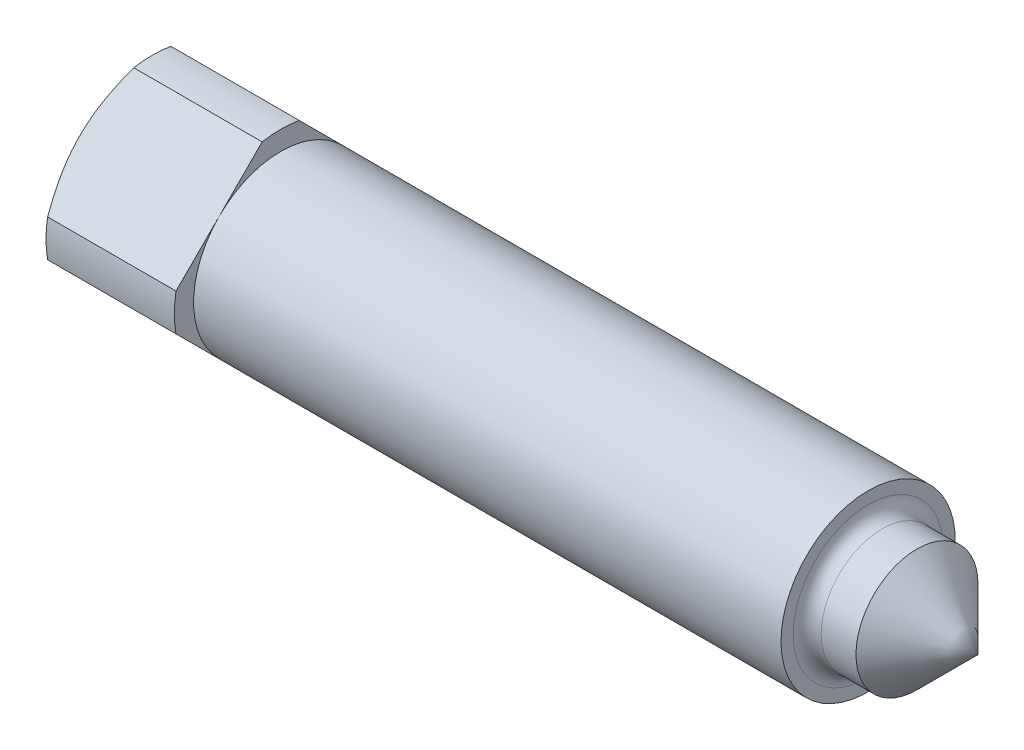
ISO-10303-21;
HEADER;
FILE_DESCRIPTION(('STEP AP214'),'2;1');
FILE_NAME('part.step','',(''),(''),'','','');
FILE_SCHEMA(('AUTOMOTIVE_DESIGN { 1 0 10303 214 1 1 1 1 }'));
ENDSEC;
DATA;
#1=APPLICATION_CONTEXT('core data for automotive mechanical design processes');
#2=APPLICATION_PROTOCOL_DEFINITION('international standard','automotive_design',2000,#1);
#3=PRODUCT_CONTEXT('',#1,'mechanical');
#4=PRODUCT('Part','Part','',(#3));
#5=PRODUCT_RELATED_PRODUCT_CATEGORY('part','',(#4));
#6=PRODUCT_DEFINITION_FORMATION('','',#4);
#7=PRODUCT_DEFINITION_CONTEXT('part definition',#1,'design');
#8=PRODUCT_DEFINITION('design','',#6,#7);
#9=PRODUCT_DEFINITION_SHAPE('','',#8);
#10=(LENGTH_UNIT() NAMED_UNIT(*) SI_UNIT(.MILLI.,.METRE.));
#11=(NAMED_UNIT(*) PLANE_ANGLE_UNIT() SI_UNIT($,.RADIAN.));
#12=(NAMED_UNIT(*) SI_UNIT($,.STERADIAN.) SOLID_ANGLE_UNIT());
#13=UNCERTAINTY_MEASURE_WITH_UNIT(LENGTH_MEASURE(1.E-05),#10,'distance_accuracy_value','');
#14=(GEOMETRIC_REPRESENTATION_CONTEXT(3) GLOBAL_UNCERTAINTY_ASSIGNED_CONTEXT((#13)) GLOBAL_UNIT_ASSIGNED_CONTEXT((#10,
#11,#12)) REPRESENTATION_CONTEXT('',''));
#15=CARTESIAN_POINT('',(0.,0.,0.));
#16=DIRECTION('',(0.,0.,1.));
#17=DIRECTION('',(1.,0.,0.));
#18=AXIS2_PLACEMENT_3D('',#15,#16,#17);
#19=CARTESIAN_POINT('',(8.,0.,0.));
#20=DIRECTION('',(1.,0.,0.));
#21=DIRECTION('',(0.,0.,-1.));
#22=AXIS2_PLACEMENT_3D('',#19,#20,#21);
#23=PLANE('',#22);
#24=CARTESIAN_POINT('',(8.00000000011369,0.,0.));
#25=DIRECTION('',(1.,0.,0.));
#26=DIRECTION('',(0.,1.,0.));
#27=AXIS2_PLACEMENT_3D('',#24,#25,#26);
#28=CIRCLE('',#27,5.);
#29=CARTESIAN_POINT('',(8.00000000011369,3.53553390593274,3.53553390593274));
#30=VERTEX_POINT('',#29);
#31=CARTESIAN_POINT('',(8.00000000011369,-3.53553390593273,3.53553390593274));
#32=VERTEX_POINT('',#31);
#33=EDGE_CURVE('E149',#30,#32,#28,.T.);
#34=ORIENTED_EDGE('',*,*,#33,.F.);
#35=DIRECTION('',(0.,0.707106781186547,-0.707106781186548));
#36=VECTOR('',#35,1.);
#37=CARTESIAN_POINT('',(8.00000000011369,0.,7.07106781186547));
#38=LINE('',#37,#36);
#39=CARTESIAN_POINT('',(8.00000000011369,1.06470408581157,6.0063637260539));
#40=VERTEX_POINT('',#39);
#41=EDGE_CURVE('E262',#40,#30,#38,.T.);
#42=ORIENTED_EDGE('',*,*,#41,.F.);
#43=CARTESIAN_POINT('',(8.,0.,0.));
#44=DIRECTION('',(1.,0.,0.));
#45=DIRECTION('',(0.,0.,-1.));
#46=AXIS2_PLACEMENT_3D('',#43,#44,#45);
#47=CIRCLE('',#46,6.1);
#48=CARTESIAN_POINT('',(8.00000000011369,-1.06470408581157,6.0063637260539));
#49=VERTEX_POINT('',#48);
#50=EDGE_CURVE('E275',#40,#49,#47,.T.);
#51=ORIENTED_EDGE('',*,*,#50,.T.);
#52=DIRECTION('',(0.,0.707106781186548,0.707106781186547));
#53=VECTOR('',#52,1.);
#54=CARTESIAN_POINT('',(8.00000000011369,-7.07106781186547,0.));
#55=LINE('',#54,#53);
#56=EDGE_CURVE('E264',#32,#49,#55,.T.);
#57=ORIENTED_EDGE('',*,*,#56,.F.);
#58=EDGE_LOOP('',(#34,#42,#51,#57));
#59=FACE_BOUND('',#58,.T.);
#60=ADVANCED_FACE('F44',(#59),#23,.T.);
#61=CARTESIAN_POINT('',(8.00000000011369,-3.53553390593274,-3.53553390593274));
#62=VERTEX_POINT('',#61);
#63=EDGE_CURVE('E155',#32,#62,#28,.T.);
#64=ORIENTED_EDGE('',*,*,#63,.F.);
#65=CARTESIAN_POINT('',(8.00000000011369,-6.0063637260539,1.06470408581157));
#66=VERTEX_POINT('',#65);
#67=EDGE_CURVE('E313',#66,#32,#55,.T.);
#68=ORIENTED_EDGE('',*,*,#67,.F.);
#69=CARTESIAN_POINT('',(8.00000000011369,-6.00636372605391,-1.06470408581157));
#70=VERTEX_POINT('',#69);
#71=EDGE_CURVE('E278',#66,#70,#47,.T.);
#72=ORIENTED_EDGE('',*,*,#71,.T.);
#73=DIRECTION('',(0.,-0.707106781186547,0.707106781186548));
#74=VECTOR('',#73,1.);
#75=CARTESIAN_POINT('',(8.00000000011369,0.,-7.07106781186547));
#76=LINE('',#75,#74);
#77=EDGE_CURVE('E307',#62,#70,#76,.T.);
#78=ORIENTED_EDGE('',*,*,#77,.F.);
#79=EDGE_LOOP('',(#64,#68,#72,#78));
#80=FACE_BOUND('',#79,.T.);
#81=ADVANCED_FACE('F248',(#80),#23,.T.);
#82=CARTESIAN_POINT('',(8.00000000011369,3.53553390593274,-3.53553390593274));
#83=VERTEX_POINT('',#82);
#84=EDGE_CURVE('E66',#62,#83,#28,.T.);
#85=ORIENTED_EDGE('',*,*,#84,.F.);
#86=CARTESIAN_POINT('',(8.00000000011369,-1.06470408581157,-6.00636372605391));
#87=VERTEX_POINT('',#86);
#88=EDGE_CURVE('E304',#87,#62,#76,.T.);
#89=ORIENTED_EDGE('',*,*,#88,.F.);
#90=CARTESIAN_POINT('',(8.00000000011369,1.06470408581157,-6.0063637260539));
#91=VERTEX_POINT('',#90);
#92=EDGE_CURVE('E276',#87,#91,#47,.T.);
#93=ORIENTED_EDGE('',*,*,#92,.T.);
#94=DIRECTION('',(0.,-0.707106781186548,-0.707106781186547));
#95=VECTOR('',#94,1.);
#96=CARTESIAN_POINT('',(8.00000000011369,7.07106781186547,0.));
#97=LINE('',#96,#95);
#98=EDGE_CURVE('E311',#83,#91,#97,.T.);
#99=ORIENTED_EDGE('',*,*,#98,.F.);
#100=EDGE_LOOP('',(#85,#89,#93,#99));
#101=FACE_BOUND('',#100,.T.);
#102=ADVANCED_FACE('F234',(#101),#23,.T.);
#103=CARTESIAN_POINT('',(8.,0.,0.));
#104=DIRECTION('',(-1.,0.,0.));
#105=DIRECTION('',(0.,0.,1.));
#106=AXIS2_PLACEMENT_3D('',#103,#104,#105);
#107=CYLINDRICAL_SURFACE('',#106,6.1);
#108=DIRECTION('',(-1.,0.,0.));
#109=VECTOR('',#108,1.);
#110=CARTESIAN_POINT('',(8.,1.06470408581157,6.0063637260539));
#111=LINE('',#110,#109);
#112=CARTESIAN_POINT('',(0.63508529610858,1.06470408581157,6.0063637260539));
#113=VERTEX_POINT('',#112);
#114=EDGE_CURVE('E302',#113,#40,#111,.F.);
#115=ORIENTED_EDGE('',*,*,#114,.F.);
#116=CARTESIAN_POINT('',(0.63508529610858,0.,0.));
#117=DIRECTION('',(1.,0.,0.));
#118=DIRECTION('',(0.,1.,0.));
#119=AXIS2_PLACEMENT_3D('',#116,#117,#118);
#120=CIRCLE('',#119,6.1);
#121=CARTESIAN_POINT('',(0.635085296108581,-1.06470408581157,6.00636372605391));
#122=VERTEX_POINT('',#121);
#123=EDGE_CURVE('E163',#113,#122,#120,.T.);
#124=ORIENTED_EDGE('',*,*,#123,.T.);
#125=DIRECTION('',(-1.,0.,0.));
#126=VECTOR('',#125,1.);
#127=CARTESIAN_POINT('',(8.,-1.06470408581157,6.00636372605391));
#128=LINE('',#127,#126);
#129=EDGE_CURVE('E281',#49,#122,#128,.T.);
#130=ORIENTED_EDGE('',*,*,#129,.F.);
#131=ORIENTED_EDGE('',*,*,#50,.F.);
#132=EDGE_LOOP('',(#115,#124,#130,#131));
#133=FACE_BOUND('',#132,.T.);
#134=ADVANCED_FACE('F238',(#133),#107,.T.);
#135=DIRECTION('',(-1.,0.,0.));
#136=VECTOR('',#135,1.);
#137=CARTESIAN_POINT('',(8.,-6.0063637260539,1.06470408581157));
#138=LINE('',#137,#136);
#139=CARTESIAN_POINT('',(0.635085296108581,-6.0063637260539,1.06470408581157));
#140=VERTEX_POINT('',#139);
#141=EDGE_CURVE('E285',#140,#66,#138,.F.);
#142=ORIENTED_EDGE('',*,*,#141,.F.);
#143=CARTESIAN_POINT('',(0.63508529610858,0.,0.));
#144=DIRECTION('',(1.,0.,0.));
#145=DIRECTION('',(0.,1.,0.));
#146=AXIS2_PLACEMENT_3D('',#143,#144,#145);
#147=CIRCLE('',#146,6.1);
#148=CARTESIAN_POINT('',(0.635085296108581,-6.00636372605391,-1.06470408581157));
#149=VERTEX_POINT('',#148);
#150=EDGE_CURVE('E159',#140,#149,#147,.T.);
#151=ORIENTED_EDGE('',*,*,#150,.T.);
#152=DIRECTION('',(-1.,0.,0.));
#153=VECTOR('',#152,1.);
#154=CARTESIAN_POINT('',(8.,-6.00636372605391,-1.06470408581157));
#155=LINE('',#154,#153);
#156=EDGE_CURVE('E287',#70,#149,#155,.T.);
#157=ORIENTED_EDGE('',*,*,#156,.F.);
#158=ORIENTED_EDGE('',*,*,#71,.F.);
#159=EDGE_LOOP('',(#142,#151,#157,#158));
#160=FACE_BOUND('',#159,.T.);
#161=ADVANCED_FACE('F240',(#160),#107,.T.);
#162=DIRECTION('',(-1.,0.,0.));
#163=VECTOR('',#162,1.);
#164=CARTESIAN_POINT('',(8.,-1.06470408581157,-6.00636372605391));
#165=LINE('',#164,#163);
#166=CARTESIAN_POINT('',(0.635085296108581,-1.06470408581157,-6.00636372605391));
#167=VERTEX_POINT('',#166);
#168=EDGE_CURVE('E292',#167,#87,#165,.F.);
#169=ORIENTED_EDGE('',*,*,#168,.F.);
#170=CARTESIAN_POINT('',(0.63508529610858,0.,0.));
#171=DIRECTION('',(1.,0.,0.));
#172=DIRECTION('',(0.,1.,0.));
#173=AXIS2_PLACEMENT_3D('',#170,#171,#172);
#174=CIRCLE('',#173,6.1);
#175=CARTESIAN_POINT('',(0.63508529610858,1.06470408581157,-6.0063637260539));
#176=VERTEX_POINT('',#175);
#177=EDGE_CURVE('E214',#167,#176,#174,.T.);
#178=ORIENTED_EDGE('',*,*,#177,.T.);
#179=DIRECTION('',(-1.,0.,0.));
#180=VECTOR('',#179,1.);
#181=CARTESIAN_POINT('',(8.,1.06470408581157,-6.00636372605391));
#182=LINE('',#181,#180);
#183=EDGE_CURVE('E294',#91,#176,#182,.T.);
#184=ORIENTED_EDGE('',*,*,#183,.F.);
#185=ORIENTED_EDGE('',*,*,#92,.F.);
#186=EDGE_LOOP('',(#169,#178,#184,#185));
#187=FACE_BOUND('',#186,.T.);
#188=ADVANCED_FACE('F245',(#187),#107,.T.);
#189=DIRECTION('',(-1.,0.,0.));
#190=VECTOR('',#189,1.);
#191=CARTESIAN_POINT('',(8.,6.0063637260539,-1.06470408581157));
#192=LINE('',#191,#190);
#193=CARTESIAN_POINT('',(0.63508529610858,6.0063637260539,-1.06470408581157));
#194=VERTEX_POINT('',#193);
#195=CARTESIAN_POINT('',(8.00000000011369,6.0063637260539,-1.06470408581157));
#196=VERTEX_POINT('',#195);
#197=EDGE_CURVE('E297',#194,#196,#192,.F.);
#198=ORIENTED_EDGE('',*,*,#197,.F.);
#199=CARTESIAN_POINT('',(0.63508529610858,0.,0.));
#200=DIRECTION('',(1.,0.,0.));
#201=DIRECTION('',(0.,1.,0.));
#202=AXIS2_PLACEMENT_3D('',#199,#200,#201);
#203=CIRCLE('',#202,6.1);
#204=CARTESIAN_POINT('',(0.63508529610858,6.00636372605391,1.06470408581157));
#205=VERTEX_POINT('',#204);
#206=EDGE_CURVE('E215',#194,#205,#203,.T.);
#207=ORIENTED_EDGE('',*,*,#206,.T.);
#208=DIRECTION('',(-1.,0.,0.));
#209=VECTOR('',#208,1.);
#210=CARTESIAN_POINT('',(8.,6.00636372605391,1.06470408581157));
#211=LINE('',#210,#209);
#212=CARTESIAN_POINT('',(8.00000000011369,6.00636372605391,1.06470408581157));
#213=VERTEX_POINT('',#212);
#214=EDGE_CURVE('E299',#213,#205,#211,.T.);
#215=ORIENTED_EDGE('',*,*,#214,.F.);
#216=EDGE_CURVE('E271',#196,#213,#47,.T.);
#217=ORIENTED_EDGE('',*,*,#216,.F.);
#218=EDGE_LOOP('',(#198,#207,#215,#217));
#219=FACE_BOUND('',#218,.T.);
#220=ADVANCED_FACE('F233',(#219),#107,.T.);
#221=EDGE_CURVE('E59',#83,#30,#28,.T.);
#222=ORIENTED_EDGE('',*,*,#221,.F.);
#223=EDGE_CURVE('E308',#196,#83,#97,.T.);
#224=ORIENTED_EDGE('',*,*,#223,.F.);
#225=ORIENTED_EDGE('',*,*,#216,.T.);
#226=EDGE_CURVE('E312',#30,#213,#38,.T.);
#227=ORIENTED_EDGE('',*,*,#226,.F.);
#228=EDGE_LOOP('',(#222,#224,#225,#227));
#229=FACE_BOUND('',#228,.T.);
#230=ADVANCED_FACE('F224',(#229),#23,.T.);
#231=CARTESIAN_POINT('',(8.00000000011369,0.,7.07106781186547));
#232=DIRECTION('',(0.,0.707106781186548,0.707106781186547));
#233=DIRECTION('',(0.,-0.707106781186547,0.707106781186548));
#234=AXIS2_PLACEMENT_3D('',#231,#232,#233);
#235=PLANE('',#234);
#236=CARTESIAN_POINT('',(0.635178841882398,1.06450408581157,6.0065637260539));
#237=CARTESIAN_POINT('',(0.591376084549744,1.15816664976561,5.91290116209986));
#238=CARTESIAN_POINT('',(0.549068060422887,1.25217965108725,5.81888816077823));
#239=CARTESIAN_POINT('',(0.467916232457448,1.44098109845808,5.6300867134074));
#240=CARTESIAN_POINT('',(0.429073524576002,1.53576977955261,5.53529803231286));
#241=CARTESIAN_POINT('',(0.318241237304539,1.82198078217846,5.24908702968702));
#242=CARTESIAN_POINT('',(0.252257433888584,2.01460061930946,5.05646719255601));
#243=CARTESIAN_POINT('',(0.142545898704386,2.3971372646041,4.67393054726138));
#244=CARTESIAN_POINT('',(0.098216572259731,2.58696501893815,4.48410279292732));
#245=CARTESIAN_POINT('',(0.049255110332229,2.87302858141963,4.19803923044585));
#246=CARTESIAN_POINT('',(0.0358601694875794,2.96853197305259,4.10253583881288));
#247=CARTESIAN_POINT('',(0.015218673885535,3.15986670614549,3.91120110571999));
#248=CARTESIAN_POINT('',(0.0079715223841649,3.25569801486882,3.81536979699665));
#249=CARTESIAN_POINT('',(-0.000792497973829929,3.46232689795169,3.60874091391378));
#250=CARTESIAN_POINT('',(-0.0012502509147384,3.57314777957557,3.4979200322899));
#251=CARTESIAN_POINT('',(0.00633136216952085,3.79464575646024,3.27642205540524));
#252=CARTESIAN_POINT('',(0.0143711123132381,3.9053228449946,3.16574496687087));
#253=CARTESIAN_POINT('',(0.0386738596299636,4.12646689071007,2.9446009211554));
#254=CARTESIAN_POINT('',(0.0549549379513906,4.23693284746169,2.83413496440378));
#255=CARTESIAN_POINT('',(0.0951773370104045,4.45714969956085,2.61391811230463));
#256=CARTESIAN_POINT('',(0.119118527439621,4.56690060703988,2.50416720482559));
#257=CARTESIAN_POINT('',(0.203251467451891,4.90246903427259,2.16859877759288));
#258=CARTESIAN_POINT('',(0.274828664656417,5.1268844387094,1.94418337315608));
#259=CARTESIAN_POINT('',(0.398854713671456,5.45973288677828,1.6113349250872));
#260=CARTESIAN_POINT('',(0.442866191104994,5.56983121724341,1.50123659462206));
#261=CARTESIAN_POINT('',(0.535646948067762,5.78896055209313,1.28210725977235));
#262=CARTESIAN_POINT('',(0.584413702772941,5.89799208941831,1.17307572244717));
#263=CARTESIAN_POINT('',(0.635178841882398,6.0065637260539,1.06450408581157));
#264=B_SPLINE_CURVE_WITH_KNOTS('',3,(#236,#237,#238,#239,#240,#241,#242,#243,#244,#245,#246,
#247,#248,#249,#250,#251,#252,#253,#254,#255,#256,#257,#258,#259,#260,#261,#262,#263),
.UNSPECIFIED.,.F.,.F.,(4,2,2,2,2,2,2,2,2,2,2,2,2,4),(0.,0.418527399230719,0.837186698102579,
1.67740123712825,2.49271669788959,2.89976997490542,3.30678373618958,3.7767217683547,
4.24668104436452,4.7176758905561,5.18866272494481,6.16336580892375,6.64872980232178,
7.13383747959991),.UNSPECIFIED.);
#265=CARTESIAN_POINT('',(0.,3.53553390593274,3.53553390593274));
#266=VERTEX_POINT('',#265);
#267=EDGE_CURVE('E175',#113,#266,#264,.T.);
#268=ORIENTED_EDGE('',*,*,#267,.F.);
#269=ORIENTED_EDGE('',*,*,#114,.T.);
#270=ORIENTED_EDGE('',*,*,#41,.T.);
#271=ORIENTED_EDGE('',*,*,#226,.T.);
#272=ORIENTED_EDGE('',*,*,#214,.T.);
#273=EDGE_CURVE('E316',#266,#205,#264,.T.);
#274=ORIENTED_EDGE('',*,*,#273,.F.);
#275=EDGE_LOOP('',(#268,#269,#270,#271,#272,#274));
#276=FACE_BOUND('',#275,.T.);
#277=ADVANCED_FACE('F220',(#276),#235,.T.);
#278=CARTESIAN_POINT('',(8.00000000011369,7.07106781186547,0.));
#279=DIRECTION('',(0.,0.707106781186547,-0.707106781186548));
#280=DIRECTION('',(0.,0.707106781186548,0.707106781186547));
#281=AXIS2_PLACEMENT_3D('',#278,#279,#280);
#282=PLANE('',#281);
#283=CARTESIAN_POINT('',(0.635178841882398,6.0065637260539,-1.06450408581157));
#284=CARTESIAN_POINT('',(0.591376084549744,5.91290116209987,-1.15816664976561));
#285=CARTESIAN_POINT('',(0.549068060422887,5.81888816077823,-1.25217965108724));
#286=CARTESIAN_POINT('',(0.467916232457448,5.6300867134074,-1.44098109845808));
#287=CARTESIAN_POINT('',(0.429073524576002,5.53529803231287,-1.53576977955261));
#288=CARTESIAN_POINT('',(0.318241237304539,5.24908702968702,-1.82198078217845));
#289=CARTESIAN_POINT('',(0.252257433888585,5.05646719255602,-2.01460061930946));
#290=CARTESIAN_POINT('',(0.142545898704387,4.67393054726138,-2.39713726460409));
#291=CARTESIAN_POINT('',(0.0982165722597308,4.48410279292732,-2.58696501893815));
#292=CARTESIAN_POINT('',(0.0492551103322288,4.19803923044585,-2.87302858141962));
#293=CARTESIAN_POINT('',(0.0358601694875792,4.10253583881288,-2.96853197305259));
#294=CARTESIAN_POINT('',(0.0152186738855344,3.91120110571999,-3.15986670614549));
#295=CARTESIAN_POINT('',(0.00797152238416385,3.81536979699665,-3.25569801486882));
#296=CARTESIAN_POINT('',(-0.000792497973830948,3.60874091391378,-3.46232689795169));
#297=CARTESIAN_POINT('',(-0.00125025091473871,3.4979200322899,-3.57314777957557));
#298=CARTESIAN_POINT('',(0.00633136216952073,3.27642205540524,-3.79464575646024));
#299=CARTESIAN_POINT('',(0.0143711123132375,3.16574496687087,-3.9053228449946));
#300=CARTESIAN_POINT('',(0.038673859629963,2.9446009211554,-4.12646689071007));
#301=CARTESIAN_POINT('',(0.0549549379513905,2.83413496440378,-4.23693284746169));
#302=CARTESIAN_POINT('',(0.0951773370104044,2.61391811230463,-4.45714969956084));
#303=CARTESIAN_POINT('',(0.11911852743962,2.50416720482559,-4.56690060703988));
#304=CARTESIAN_POINT('',(0.20325146745189,2.16859877759288,-4.90246903427259));
#305=CARTESIAN_POINT('',(0.274828664656417,1.94418337315608,-5.12688443870939));
#306=CARTESIAN_POINT('',(0.398854713671456,1.6113349250872,-5.45973288677828));
#307=CARTESIAN_POINT('',(0.442866191104995,1.50123659462206,-5.56983121724341));
#308=CARTESIAN_POINT('',(0.535646948067761,1.28210725977235,-5.78896055209313));
#309=CARTESIAN_POINT('',(0.584413702772941,1.17307572244717,-5.89799208941831));
#310=CARTESIAN_POINT('',(0.635178841882398,1.06450408581157,-6.0065637260539));
#311=B_SPLINE_CURVE_WITH_KNOTS('',3,(#283,#284,#285,#286,#287,#288,#289,#290,#291,#292,#293,
#294,#295,#296,#297,#298,#299,#300,#301,#302,#303,#304,#305,#306,#307,#308,#309,#310),
.UNSPECIFIED.,.F.,.F.,(4,2,2,2,2,2,2,2,2,2,2,2,2,4),(0.,0.418527399230718,0.837186698102578,
1.67740123712825,2.49271669788959,2.89976997490542,3.30678373618958,3.7767217683547,
4.24668104436453,4.7176758905561,5.18866272494481,6.16336580892376,6.64872980232178,
7.13383747959991),.UNSPECIFIED.);
#312=CARTESIAN_POINT('',(0.,3.53553390593274,-3.53553390593274));
#313=VERTEX_POINT('',#312);
#314=EDGE_CURVE('E213',#194,#313,#311,.T.);
#315=ORIENTED_EDGE('',*,*,#314,.F.);
#316=ORIENTED_EDGE('',*,*,#197,.T.);
#317=ORIENTED_EDGE('',*,*,#223,.T.);
#318=ORIENTED_EDGE('',*,*,#98,.T.);
#319=ORIENTED_EDGE('',*,*,#183,.T.);
#320=EDGE_CURVE('E207',#313,#176,#311,.T.);
#321=ORIENTED_EDGE('',*,*,#320,.F.);
#322=EDGE_LOOP('',(#315,#316,#317,#318,#319,#321));
#323=FACE_BOUND('',#322,.T.);
#324=ADVANCED_FACE('F217',(#323),#282,.T.);
#325=CARTESIAN_POINT('',(8.00000000011369,0.,-7.07106781186547));
#326=DIRECTION('',(0.,-0.707106781186548,-0.707106781186547));
#327=DIRECTION('',(0.,0.707106781186547,-0.707106781186548));
#328=AXIS2_PLACEMENT_3D('',#325,#326,#327);
#329=PLANE('',#328);
#330=CARTESIAN_POINT('',(0.635178841882399,-1.06450408581157,-6.0065637260539));
#331=CARTESIAN_POINT('',(0.591376084549745,-1.15816664976561,-5.91290116209987));
#332=CARTESIAN_POINT('',(0.549068060422888,-1.25217965108724,-5.81888816077823));
#333=CARTESIAN_POINT('',(0.467916232457448,-1.44098109845807,-5.6300867134074));
#334=CARTESIAN_POINT('',(0.429073524576002,-1.53576977955261,-5.53529803231287));
#335=CARTESIAN_POINT('',(0.31824123730454,-1.82198078217845,-5.24908702968702));
#336=CARTESIAN_POINT('',(0.252257433888585,-2.01460061930946,-5.05646719255602));
#337=CARTESIAN_POINT('',(0.142545898704387,-2.39713726460409,-4.67393054726138));
#338=CARTESIAN_POINT('',(0.0982165722597315,-2.58696501893815,-4.48410279292732));
#339=CARTESIAN_POINT('',(0.0492551103322293,-2.87302858141962,-4.19803923044585));
#340=CARTESIAN_POINT('',(0.0358601694875796,-2.96853197305259,-4.10253583881288));
#341=CARTESIAN_POINT('',(0.0152186738855349,-3.15986670614548,-3.91120110571999));
#342=CARTESIAN_POINT('',(0.00797152238416454,-3.25569801486882,-3.81536979699665));
#343=CARTESIAN_POINT('',(-0.000792497973830473,-3.46232689795169,-3.60874091391378));
#344=CARTESIAN_POINT('',(-0.00125025091473876,-3.57314777957557,-3.49792003228991));
#345=CARTESIAN_POINT('',(0.0063313621695205,-3.79464575646023,-3.27642205540524));
#346=CARTESIAN_POINT('',(0.0143711123132376,-3.9053228449946,-3.16574496687087));
#347=CARTESIAN_POINT('',(0.0386738596299631,-4.12646689071007,-2.9446009211554));
#348=CARTESIAN_POINT('',(0.0549549379513901,-4.23693284746169,-2.83413496440378));
#349=CARTESIAN_POINT('',(0.0951773370104042,-4.45714969956084,-2.61391811230463));
#350=CARTESIAN_POINT('',(0.119118527439621,-4.56690060703988,-2.50416720482559));
#351=CARTESIAN_POINT('',(0.203251467451891,-4.90246903427259,-2.16859877759288));
#352=CARTESIAN_POINT('',(0.274828664656417,-5.12688443870939,-1.94418337315608));
#353=CARTESIAN_POINT('',(0.398854713671457,-5.45973288677828,-1.6113349250872));
#354=CARTESIAN_POINT('',(0.442866191104996,-5.56983121724341,-1.50123659462206));
#355=CARTESIAN_POINT('',(0.535646948067763,-5.78896055209313,-1.28210725977234));
#356=CARTESIAN_POINT('',(0.584413702772943,-5.89799208941831,-1.17307572244716));
#357=CARTESIAN_POINT('',(0.635178841882401,-6.00656372605391,-1.06450408581157));
#358=B_SPLINE_CURVE_WITH_KNOTS('',3,(#330,#331,#332,#333,#334,#335,#336,#337,#338,#339,#340,
#341,#342,#343,#344,#345,#346,#347,#348,#349,#350,#351,#352,#353,#354,#355,#356,#357),
.UNSPECIFIED.,.F.,.F.,(4,2,2,2,2,2,2,2,2,2,2,2,2,4),(0.,0.418527399230719,0.837186698102579,
1.67740123712825,2.49271669788959,2.89976997490543,3.30678373618957,3.7767217683547,
4.24668104436453,4.7176758905561,5.18866272494481,6.16336580892376,6.64872980232179,
7.13383747959992),.UNSPECIFIED.);
#359=CARTESIAN_POINT('',(0.,-3.53553390593274,-3.53553390593274));
#360=VERTEX_POINT('',#359);
#361=EDGE_CURVE('E174',#167,#360,#358,.T.);
#362=ORIENTED_EDGE('',*,*,#361,.F.);
#363=ORIENTED_EDGE('',*,*,#168,.T.);
#364=ORIENTED_EDGE('',*,*,#88,.T.);
#365=ORIENTED_EDGE('',*,*,#77,.T.);
#366=ORIENTED_EDGE('',*,*,#156,.T.);
#367=EDGE_CURVE('E166',#360,#149,#358,.T.);
#368=ORIENTED_EDGE('',*,*,#367,.F.);
#369=EDGE_LOOP('',(#362,#363,#364,#365,#366,#368));
#370=FACE_BOUND('',#369,.T.);
#371=ADVANCED_FACE('F182',(#370),#329,.T.);
#372=CARTESIAN_POINT('',(8.00000000011369,-7.07106781186547,0.));
#373=DIRECTION('',(0.,-0.707106781186547,0.707106781186548));
#374=DIRECTION('',(0.,-0.707106781186548,-0.707106781186547));
#375=AXIS2_PLACEMENT_3D('',#372,#373,#374);
#376=PLANE('',#375);
#377=CARTESIAN_POINT('',(0.635178841882399,-6.0065637260539,1.06450408581157));
#378=CARTESIAN_POINT('',(0.591376084549745,-5.91290116209987,1.15816664976561));
#379=CARTESIAN_POINT('',(0.549068060422888,-5.81888816077823,1.25217965108724));
#380=CARTESIAN_POINT('',(0.467916232457448,-5.6300867134074,1.44098109845808));
#381=CARTESIAN_POINT('',(0.429073524576003,-5.53529803231287,1.53576977955261));
#382=CARTESIAN_POINT('',(0.31824123730454,-5.24908702968702,1.82198078217845));
#383=CARTESIAN_POINT('',(0.252257433888585,-5.05646719255602,2.01460061930946));
#384=CARTESIAN_POINT('',(0.142545898704387,-4.67393054726138,2.39713726460409));
#385=CARTESIAN_POINT('',(0.0982165722597308,-4.48410279292732,2.58696501893815));
#386=CARTESIAN_POINT('',(0.0492551103322289,-4.19803923044585,2.87302858141962));
#387=CARTESIAN_POINT('',(0.0358601694875794,-4.10253583881288,2.96853197305259));
#388=CARTESIAN_POINT('',(0.0152186738855347,-3.91120110571999,3.15986670614549));
#389=CARTESIAN_POINT('',(0.00797152238416426,-3.81536979699665,3.25569801486882));
#390=CARTESIAN_POINT('',(-0.000792497973830551,-3.60874091391378,3.46232689795169));
#391=CARTESIAN_POINT('',(-0.00125025091473845,-3.4979200322899,3.57314777957557));
#392=CARTESIAN_POINT('',(0.00633136216952062,-3.27642205540524,3.79464575646024));
#393=CARTESIAN_POINT('',(0.0143711123132371,-3.16574496687087,3.9053228449946));
#394=CARTESIAN_POINT('',(0.0386738596299623,-2.9446009211554,4.12646689071007));
#395=CARTESIAN_POINT('',(0.0549549379513896,-2.83413496440378,4.23693284746169));
#396=CARTESIAN_POINT('',(0.0951773370104039,-2.61391811230463,4.45714969956084));
#397=CARTESIAN_POINT('',(0.11911852743962,-2.50416720482559,4.56690060703988));
#398=CARTESIAN_POINT('',(0.20325146745189,-2.16859877759288,4.90246903427259));
#399=CARTESIAN_POINT('',(0.274828664656417,-1.94418337315608,5.12688443870939));
#400=CARTESIAN_POINT('',(0.398854713671456,-1.6113349250872,5.45973288677827));
#401=CARTESIAN_POINT('',(0.442866191104995,-1.50123659462206,5.56983121724341));
#402=CARTESIAN_POINT('',(0.535646948067762,-1.28210725977234,5.78896055209313));
#403=CARTESIAN_POINT('',(0.584413702772941,-1.17307572244716,5.89799208941831));
#404=CARTESIAN_POINT('',(0.635178841882399,-1.06450408581157,6.0065637260539));
#405=B_SPLINE_CURVE_WITH_KNOTS('',3,(#377,#378,#379,#380,#381,#382,#383,#384,#385,#386,#387,
#388,#389,#390,#391,#392,#393,#394,#395,#396,#397,#398,#399,#400,#401,#402,#403,#404),
.UNSPECIFIED.,.F.,.F.,(4,2,2,2,2,2,2,2,2,2,2,2,2,4),(0.,0.418527399230718,0.837186698102578,
1.67740123712825,2.49271669788959,2.89976997490542,3.30678373618958,3.7767217683547,
4.24668104436453,4.7176758905561,5.18866272494481,6.16336580892376,6.64872980232178,
7.13383747959992),.UNSPECIFIED.);
#406=CARTESIAN_POINT('',(0.,-3.53553390593273,3.53553390593274));
#407=VERTEX_POINT('',#406);
#408=EDGE_CURVE('E268',#140,#407,#405,.T.);
#409=ORIENTED_EDGE('',*,*,#408,.F.);
#410=ORIENTED_EDGE('',*,*,#141,.T.);
#411=ORIENTED_EDGE('',*,*,#67,.T.);
#412=ORIENTED_EDGE('',*,*,#56,.T.);
#413=ORIENTED_EDGE('',*,*,#129,.T.);
#414=EDGE_CURVE('E198',#407,#122,#405,.T.);
#415=ORIENTED_EDGE('',*,*,#414,.F.);
#416=EDGE_LOOP('',(#409,#410,#411,#412,#413,#415));
#417=FACE_BOUND('',#416,.T.);
#418=ADVANCED_FACE('F226',(#417),#376,.T.);
#419=CARTESIAN_POINT('',(0.,0.,0.));
#420=DIRECTION('',(1.,0.,0.));
#421=DIRECTION('',(0.,1.,0.));
#422=AXIS2_PLACEMENT_3D('',#419,#420,#421);
#423=CONICAL_SURFACE('',#422,5.,1.0471975511966);
#424=ORIENTED_EDGE('',*,*,#267,.T.);
#425=CARTESIAN_POINT('',(0.,0.,0.));
#426=DIRECTION('',(1.,0.,0.));
#427=DIRECTION('',(0.,1.,0.));
#428=AXIS2_PLACEMENT_3D('',#425,#426,#427);
#429=CIRCLE('',#428,5.);
#430=EDGE_CURVE('E156',#266,#407,#429,.T.);
#431=ORIENTED_EDGE('',*,*,#430,.T.);
#432=ORIENTED_EDGE('',*,*,#414,.T.);
#433=ORIENTED_EDGE('',*,*,#123,.F.);
#434=EDGE_LOOP('',(#424,#431,#432,#433));
#435=FACE_BOUND('',#434,.T.);
#436=ADVANCED_FACE('F190',(#435),#423,.T.);
#437=ORIENTED_EDGE('',*,*,#367,.T.);
#438=ORIENTED_EDGE('',*,*,#150,.F.);
#439=ORIENTED_EDGE('',*,*,#408,.T.);
#440=EDGE_CURVE('E160',#407,#360,#429,.T.);
#441=ORIENTED_EDGE('',*,*,#440,.T.);
#442=EDGE_LOOP('',(#437,#438,#439,#441));
#443=FACE_BOUND('',#442,.T.);
#444=ADVANCED_FACE('F185',(#443),#423,.T.);
#445=ORIENTED_EDGE('',*,*,#320,.T.);
#446=ORIENTED_EDGE('',*,*,#177,.F.);
#447=ORIENTED_EDGE('',*,*,#361,.T.);
#448=EDGE_CURVE('E329',#360,#313,#429,.T.);
#449=ORIENTED_EDGE('',*,*,#448,.T.);
#450=EDGE_LOOP('',(#445,#446,#447,#449));
#451=FACE_BOUND('',#450,.T.);
#452=ADVANCED_FACE('F189',(#451),#423,.T.);
#453=ORIENTED_EDGE('',*,*,#314,.T.);
#454=EDGE_CURVE('E154',#313,#266,#429,.T.);
#455=ORIENTED_EDGE('',*,*,#454,.T.);
#456=ORIENTED_EDGE('',*,*,#273,.T.);
#457=ORIENTED_EDGE('',*,*,#206,.F.);
#458=EDGE_LOOP('',(#453,#455,#456,#457));
#459=FACE_BOUND('',#458,.T.);
#460=ADVANCED_FACE('F192',(#459),#423,.T.);
#461=CARTESIAN_POINT('',(0.,0.,0.));
#462=DIRECTION('',(1.,0.,0.));
#463=DIRECTION('',(0.,0.,-1.));
#464=AXIS2_PLACEMENT_3D('',#461,#462,#463);
#465=PLANE('',#464);
#466=ORIENTED_EDGE('',*,*,#448,.F.);
#467=ORIENTED_EDGE('',*,*,#440,.F.);
#468=ORIENTED_EDGE('',*,*,#430,.F.);
#469=ORIENTED_EDGE('',*,*,#454,.F.);
#470=EDGE_LOOP('',(#466,#467,#468,#469));
#471=FACE_BOUND('',#470,.T.);
#472=ADVANCED_FACE('F235',(#471),#465,.F.);
#473=CARTESIAN_POINT('',(14.0868030968524,0.,0.));
#474=DIRECTION('',(1.,0.,0.));
#475=DIRECTION('',(0.,1.,0.));
#476=AXIS2_PLACEMENT_3D('',#473,#474,#475);
#477=CYLINDRICAL_SURFACE('',#476,5.);
#478=CARTESIAN_POINT('',(41.7000000001137,0.,0.));
#479=DIRECTION('',(1.,0.,0.));
#480=DIRECTION('',(0.,1.,0.));
#481=AXIS2_PLACEMENT_3D('',#478,#479,#480);
#482=CIRCLE('',#481,5.);
#483=CARTESIAN_POINT('',(41.7000000001137,5.00000000000001,0.));
#484=VERTEX_POINT('',#483);
#485=EDGE_CURVE('E146',#484,#484,#482,.T.);
#486=ORIENTED_EDGE('',*,*,#485,.F.);
#487=EDGE_LOOP('',(#486));
#488=FACE_BOUND('',#487,.T.);
#489=ORIENTED_EDGE('',*,*,#33,.T.);
#490=ORIENTED_EDGE('',*,*,#63,.T.);
#491=ORIENTED_EDGE('',*,*,#84,.T.);
#492=ORIENTED_EDGE('',*,*,#221,.T.);
#493=EDGE_LOOP('',(#489,#490,#491,#492));
#494=FACE_BOUND('',#493,.T.);
#495=ADVANCED_FACE('F193',(#488,#494),#477,.T.);
#496=CARTESIAN_POINT('',(41.7000000001137,-5.,0.));
#497=DIRECTION('',(-1.,0.,0.));
#498=DIRECTION('',(0.,-1.,0.));
#499=AXIS2_PLACEMENT_3D('',#496,#497,#498);
#500=PLANE('',#499);
#501=CARTESIAN_POINT('',(41.7000000001137,0.,0.));
#502=DIRECTION('',(-1.,0.,0.));
#503=DIRECTION('',(0.,-1.,0.));
#504=AXIS2_PLACEMENT_3D('',#501,#502,#503);
#505=CIRCLE('',#504,4.3);
#506=CARTESIAN_POINT('',(41.7000000001137,-4.3,0.));
#507=VERTEX_POINT('',#506);
#508=EDGE_CURVE('E12',#507,#507,#505,.T.);
#509=ORIENTED_EDGE('',*,*,#508,.T.);
#510=EDGE_LOOP('',(#509));
#511=FACE_BOUND('',#510,.T.);
#512=ORIENTED_EDGE('',*,*,#485,.T.);
#513=EDGE_LOOP('',(#512));
#514=FACE_BOUND('',#513,.T.);
#515=ADVANCED_FACE('F351',(#511,#514),#500,.F.);
#516=CARTESIAN_POINT('',(14.0868030968524,0.,0.));
#517=DIRECTION('',(1.,0.,0.));
#518=DIRECTION('',(0.,1.,0.));
#519=AXIS2_PLACEMENT_3D('',#516,#517,#518);
#520=CYLINDRICAL_SURFACE('',#519,3.5);
#521=CARTESIAN_POINT('',(42.5000000001137,0.,0.));
#522=DIRECTION('',(-1.,0.,0.));
#523=DIRECTION('',(0.,-1.,0.));
#524=AXIS2_PLACEMENT_3D('',#521,#522,#523);
#525=CIRCLE('',#524,3.5);
#526=CARTESIAN_POINT('',(42.5000000001137,-3.5,0.));
#527=VERTEX_POINT('',#526);
#528=EDGE_CURVE('E52',#527,#527,#525,.F.);
#529=ORIENTED_EDGE('',*,*,#528,.T.);
#530=EDGE_LOOP('',(#529));
#531=FACE_BOUND('',#530,.T.);
#532=CARTESIAN_POINT('',(44.5000000001137,0.,0.));
#533=DIRECTION('',(1.,0.,0.));
#534=DIRECTION('',(0.,1.,0.));
#535=AXIS2_PLACEMENT_3D('',#532,#533,#534);
#536=CIRCLE('',#535,3.5);
#537=CARTESIAN_POINT('',(44.5000000001137,3.50000000000001,0.));
#538=VERTEX_POINT('',#537);
#539=EDGE_CURVE('E144',#538,#538,#536,.T.);
#540=ORIENTED_EDGE('',*,*,#539,.F.);
#541=EDGE_LOOP('',(#540));
#542=FACE_BOUND('',#541,.T.);
#543=ADVANCED_FACE('F140',(#531,#542),#520,.T.);
#544=CARTESIAN_POINT('',(44.5000000001137,0.,0.));
#545=DIRECTION('',(-1.,0.,0.));
#546=DIRECTION('',(0.,-1.,0.));
#547=AXIS2_PLACEMENT_3D('',#544,#545,#546);
#548=CONICAL_SURFACE('',#547,3.5,0.78539816339745);
#549=CARTESIAN_POINT('',(48.0000000001137,0.,0.));
#550=VERTEX_POINT('',#549);
#551=VERTEX_LOOP('',#550);
#552=FACE_BOUND('',#551,.T.);
#553=ORIENTED_EDGE('',*,*,#539,.T.);
#554=EDGE_LOOP('',(#553));
#555=FACE_BOUND('',#554,.T.);
#556=ADVANCED_FACE('F137',(#552,#555),#548,.T.);
#557=CARTESIAN_POINT('',(42.5000000001137,0.,0.));
#558=DIRECTION('',(-1.,0.,0.));
#559=DIRECTION('',(0.,-1.,0.));
#560=AXIS2_PLACEMENT_3D('',#557,#558,#559);
#561=TOROIDAL_SURFACE('',#560,4.3,0.8);
#562=ORIENTED_EDGE('',*,*,#508,.F.);
#563=EDGE_LOOP('',(#562));
#564=FACE_BOUND('',#563,.T.);
#565=ORIENTED_EDGE('',*,*,#528,.F.);
#566=EDGE_LOOP('',(#565));
#567=FACE_BOUND('',#566,.T.);
#568=ADVANCED_FACE('F46',(#564,#567),#561,.F.);
#569=CLOSED_SHELL('',(#60,#81,#102,#134,#161,#188,#220,#230,#277,#324,#371,#418,#436,#444,#452,
#460,#472,#495,#515,#543,#556,#568));
#570=MANIFOLD_SOLID_BREP('B2',#569);
#571=ADVANCED_BREP_SHAPE_REPRESENTATION('',(#18,#570),#14);
#572=SHAPE_DEFINITION_REPRESENTATION(#9,#571);
ENDSEC;
END-ISO-10303-21;
